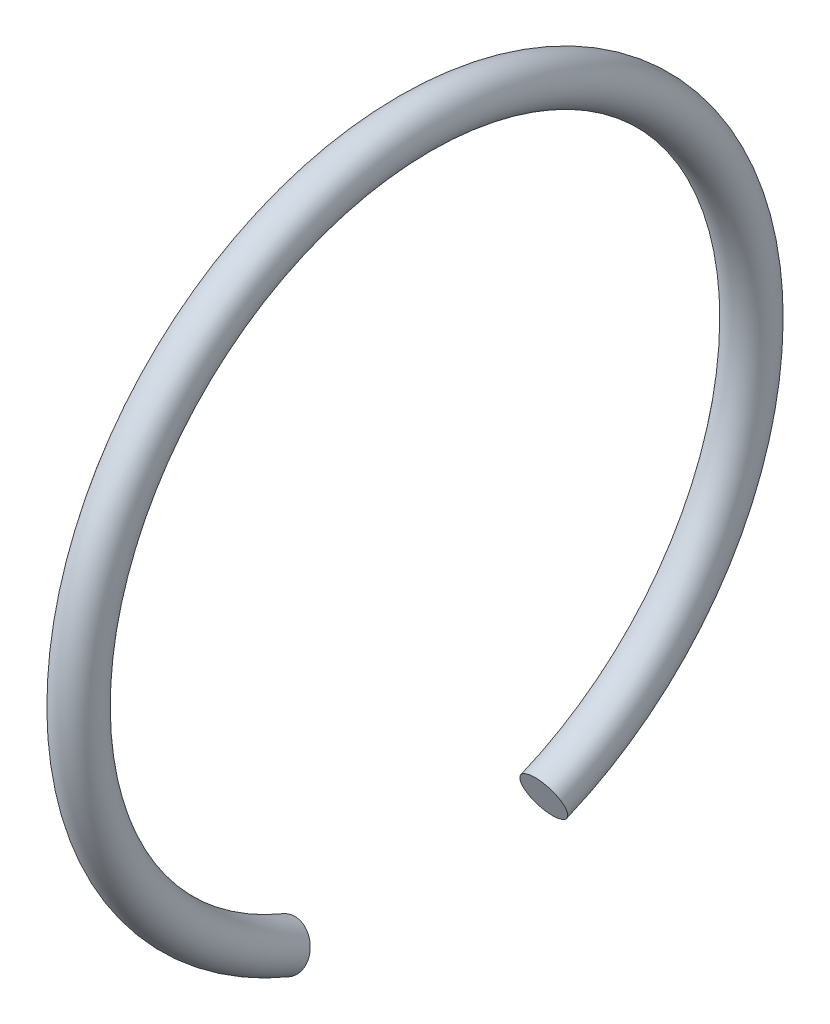
ISO-10303-21;
HEADER;
FILE_DESCRIPTION(('STEP AP214'),'2;1');
FILE_NAME('part.step','',(''),(''),'','','');
FILE_SCHEMA(('AUTOMOTIVE_DESIGN { 1 0 10303 214 1 1 1 1 }'));
ENDSEC;
DATA;
#1=APPLICATION_CONTEXT('core data for automotive mechanical design processes');
#2=APPLICATION_PROTOCOL_DEFINITION('international standard','automotive_design',2000,#1);
#3=PRODUCT_CONTEXT('',#1,'mechanical');
#4=PRODUCT('Part','Part','',(#3));
#5=PRODUCT_RELATED_PRODUCT_CATEGORY('part','',(#4));
#6=PRODUCT_DEFINITION_FORMATION('','',#4);
#7=PRODUCT_DEFINITION_CONTEXT('part definition',#1,'design');
#8=PRODUCT_DEFINITION('design','',#6,#7);
#9=PRODUCT_DEFINITION_SHAPE('','',#8);
#10=(LENGTH_UNIT() NAMED_UNIT(*) SI_UNIT(.MILLI.,.METRE.));
#11=(NAMED_UNIT(*) PLANE_ANGLE_UNIT() SI_UNIT($,.RADIAN.));
#12=(NAMED_UNIT(*) SI_UNIT($,.STERADIAN.) SOLID_ANGLE_UNIT());
#13=UNCERTAINTY_MEASURE_WITH_UNIT(LENGTH_MEASURE(1.E-05),#10,'distance_accuracy_value','');
#14=(GEOMETRIC_REPRESENTATION_CONTEXT(3) GLOBAL_UNCERTAINTY_ASSIGNED_CONTEXT((#13)) GLOBAL_UNIT_ASSIGNED_CONTEXT((#10,
#11,#12)) REPRESENTATION_CONTEXT('',''));
#15=CARTESIAN_POINT('',(0.,0.,0.));
#16=DIRECTION('',(0.,0.,1.));
#17=DIRECTION('',(1.,0.,0.));
#18=AXIS2_PLACEMENT_3D('',#15,#16,#17);
#19=CARTESIAN_POINT('',(0.,0.,0.));
#20=DIRECTION('',(-1.,0.,0.));
#21=DIRECTION('',(0.,0.,1.));
#22=AXIS2_PLACEMENT_3D('',#19,#20,#21);
#23=TOROIDAL_SURFACE('',#22,7.5,0.500000000000001);
#24=CARTESIAN_POINT('',(0.,-6.92909649383467,2.87012574273813));
#25=DIRECTION('',(0.,-0.382683432365084,-0.923879532511289));
#26=DIRECTION('',(1.,0.,0.));
#27=AXIS2_PLACEMENT_3D('',#24,#25,#26);
#28=CIRCLE('',#27,0.500000000000001);
#29=CARTESIAN_POINT('',(0.,-7.39103626009031,3.06146745892067));
#30=VERTEX_POINT('',#29);
#31=EDGE_CURVE('E10',#30,#30,#28,.T.);
#32=CARTESIAN_POINT('',(0.,-6.92909649383467,-2.87012574273813));
#33=DIRECTION('',(0.,0.382683432365084,-0.923879532511289));
#34=DIRECTION('',(1.,0.,0.));
#35=AXIS2_PLACEMENT_3D('',#32,#33,#34);
#36=CIRCLE('',#35,0.500000000000001);
#37=CARTESIAN_POINT('',(0.,-7.39103626009031,-3.06146745892067));
#38=VERTEX_POINT('',#37);
#39=EDGE_CURVE('E354',#38,#38,#36,.T.);
#40=CARTESIAN_POINT('',(0.,0.,0.));
#41=DIRECTION('',(-1.,0.,0.));
#42=DIRECTION('',(0.,0.,1.));
#43=AXIS2_PLACEMENT_3D('',#40,#41,#42);
#44=CIRCLE('',#43,8.);
#45=EDGE_CURVE('',#30,#38,#44,.T.);
#46=ORIENTED_EDGE('',*,*,#31,.F.);
#47=ORIENTED_EDGE('',*,*,#39,.T.);
#48=ORIENTED_EDGE('',*,*,#45,.T.);
#49=ORIENTED_EDGE('',*,*,#45,.F.);
#50=EDGE_LOOP('',(#46,#48,#47,#49));
#51=FACE_BOUND('',#50,.T.);
#52=ADVANCED_FACE('F348',(#51),#23,.T.);
#53=CARTESIAN_POINT('',(0.,-6.92909649383467,2.87012574273813));
#54=DIRECTION('',(0.,-0.382683432365084,-0.923879532511289));
#55=DIRECTION('',(1.,0.,0.));
#56=AXIS2_PLACEMENT_3D('',#53,#54,#55);
#57=PLANE('',#56);
#58=ORIENTED_EDGE('',*,*,#31,.T.);
#59=EDGE_LOOP('',(#58));
#60=FACE_BOUND('',#59,.T.);
#61=ADVANCED_FACE('F363',(#60),#57,.T.);
#62=CARTESIAN_POINT('',(0.,-6.92909649383467,-2.87012574273813));
#63=DIRECTION('',(0.,0.382683432365084,-0.923879532511289));
#64=DIRECTION('',(1.,0.,0.));
#65=AXIS2_PLACEMENT_3D('',#62,#63,#64);
#66=PLANE('',#65);
#67=ORIENTED_EDGE('',*,*,#39,.F.);
#68=EDGE_LOOP('',(#67));
#69=FACE_BOUND('',#68,.T.);
#70=ADVANCED_FACE('F361',(#69),#66,.F.);
#71=CLOSED_SHELL('',(#52,#61,#70));
#72=MANIFOLD_SOLID_BREP('B2',#71);
#73=ADVANCED_BREP_SHAPE_REPRESENTATION('',(#18,#72),#14);
#74=SHAPE_DEFINITION_REPRESENTATION(#9,#73);
ENDSEC;
END-ISO-10303-21;
